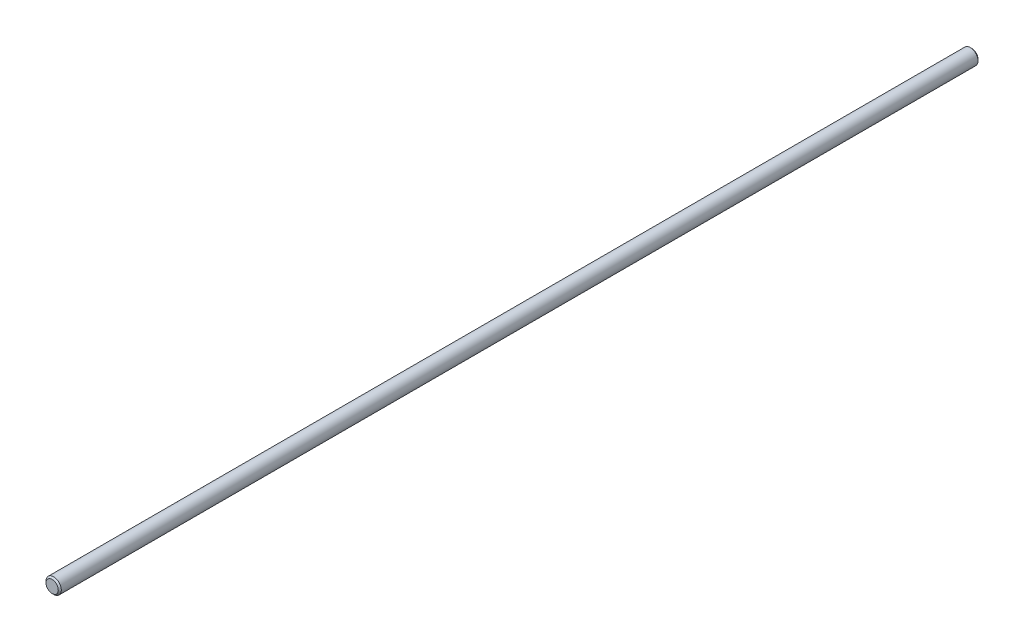
ISO-10303-21;
HEADER;
FILE_DESCRIPTION(('STEP AP214'),'2;1');
FILE_NAME('part.step','',(''),(''),'','','');
FILE_SCHEMA(('AUTOMOTIVE_DESIGN { 1 0 10303 214 1 1 1 1 }'));
ENDSEC;
DATA;
#1=APPLICATION_CONTEXT('core data for automotive mechanical design processes');
#2=APPLICATION_PROTOCOL_DEFINITION('international standard','automotive_design',2000,#1);
#3=PRODUCT_CONTEXT('',#1,'mechanical');
#4=PRODUCT('Part','Part','',(#3));
#5=PRODUCT_RELATED_PRODUCT_CATEGORY('part','',(#4));
#6=PRODUCT_DEFINITION_FORMATION('','',#4);
#7=PRODUCT_DEFINITION_CONTEXT('part definition',#1,'design');
#8=PRODUCT_DEFINITION('design','',#6,#7);
#9=PRODUCT_DEFINITION_SHAPE('','',#8);
#10=(LENGTH_UNIT() NAMED_UNIT(*) SI_UNIT(.MILLI.,.METRE.));
#11=(NAMED_UNIT(*) PLANE_ANGLE_UNIT() SI_UNIT($,.RADIAN.));
#12=(NAMED_UNIT(*) SI_UNIT($,.STERADIAN.) SOLID_ANGLE_UNIT());
#13=UNCERTAINTY_MEASURE_WITH_UNIT(LENGTH_MEASURE(1.E-05),#10,'distance_accuracy_value','');
#14=(GEOMETRIC_REPRESENTATION_CONTEXT(3) GLOBAL_UNCERTAINTY_ASSIGNED_CONTEXT((#13)) GLOBAL_UNIT_ASSIGNED_CONTEXT((#10,
#11,#12)) REPRESENTATION_CONTEXT('',''));
#15=CARTESIAN_POINT('',(0.,0.,0.));
#16=DIRECTION('',(0.,0.,1.));
#17=DIRECTION('',(1.,0.,0.));
#18=AXIS2_PLACEMENT_3D('',#15,#16,#17);
#19=CARTESIAN_POINT('',(0.,0.,762.));
#20=DIRECTION('',(0.,0.,-1.));
#21=DIRECTION('',(-1.,0.,0.));
#22=AXIS2_PLACEMENT_3D('',#19,#20,#21);
#23=CYLINDRICAL_SURFACE('',#22,12.7);
#24=CARTESIAN_POINT('',(0.,0.,-759.46));
#25=DIRECTION('',(0.,0.,1.));
#26=DIRECTION('',(1.,0.,0.));
#27=AXIS2_PLACEMENT_3D('',#24,#25,#26);
#28=CIRCLE('',#27,12.7);
#29=CARTESIAN_POINT('',(12.7,0.,-759.46));
#30=VERTEX_POINT('',#29);
#31=EDGE_CURVE('E44',#30,#30,#28,.T.);
#32=ORIENTED_EDGE('',*,*,#31,.T.);
#33=EDGE_LOOP('',(#32));
#34=FACE_BOUND('',#33,.T.);
#35=CARTESIAN_POINT('',(0.,0.,759.46));
#36=DIRECTION('',(0.,0.,1.));
#37=DIRECTION('',(1.,0.,0.));
#38=AXIS2_PLACEMENT_3D('',#35,#36,#37);
#39=CIRCLE('',#38,12.7);
#40=CARTESIAN_POINT('',(12.7,0.,759.46));
#41=VERTEX_POINT('',#40);
#42=EDGE_CURVE('E48',#41,#41,#39,.F.);
#43=ORIENTED_EDGE('',*,*,#42,.T.);
#44=EDGE_LOOP('',(#43));
#45=FACE_BOUND('',#44,.T.);
#46=ADVANCED_FACE('F33',(#34,#45),#23,.T.);
#47=CARTESIAN_POINT('',(0.,0.,762.));
#48=DIRECTION('',(0.,0.,1.));
#49=DIRECTION('',(1.,0.,0.));
#50=AXIS2_PLACEMENT_3D('',#47,#48,#49);
#51=PLANE('',#50);
#52=CARTESIAN_POINT('',(0.,0.,762.));
#53=DIRECTION('',(0.,0.,1.));
#54=DIRECTION('',(1.,0.,0.));
#55=AXIS2_PLACEMENT_3D('',#52,#53,#54);
#56=CIRCLE('',#55,10.1599999999999);
#57=CARTESIAN_POINT('',(10.1599999999999,0.,762.));
#58=VERTEX_POINT('',#57);
#59=EDGE_CURVE('E10',#58,#58,#56,.T.);
#60=ORIENTED_EDGE('',*,*,#59,.T.);
#61=EDGE_LOOP('',(#60));
#62=FACE_BOUND('',#61,.T.);
#63=ADVANCED_FACE('F64',(#62),#51,.T.);
#64=CARTESIAN_POINT('',(0.,0.,-762.));
#65=DIRECTION('',(0.,0.,1.));
#66=DIRECTION('',(1.,0.,0.));
#67=AXIS2_PLACEMENT_3D('',#64,#65,#66);
#68=PLANE('',#67);
#69=CARTESIAN_POINT('',(0.,0.,-762.));
#70=DIRECTION('',(0.,0.,1.));
#71=DIRECTION('',(1.,0.,0.));
#72=AXIS2_PLACEMENT_3D('',#69,#70,#71);
#73=CIRCLE('',#72,10.1599999999995);
#74=CARTESIAN_POINT('',(10.1599999999995,0.,-762.));
#75=VERTEX_POINT('',#74);
#76=EDGE_CURVE('E40',#75,#75,#73,.F.);
#77=ORIENTED_EDGE('',*,*,#76,.T.);
#78=EDGE_LOOP('',(#77));
#79=FACE_BOUND('',#78,.T.);
#80=ADVANCED_FACE('F61',(#79),#68,.F.);
#81=CARTESIAN_POINT('',(0.,0.,-759.46));
#82=DIRECTION('',(0.,0.,1.));
#83=DIRECTION('',(1.,0.,0.));
#84=AXIS2_PLACEMENT_3D('',#81,#82,#83);
#85=CONICAL_SURFACE('',#84,12.7,0.785398163397505);
#86=ORIENTED_EDGE('',*,*,#76,.F.);
#87=EDGE_LOOP('',(#86));
#88=FACE_BOUND('',#87,.T.);
#89=ORIENTED_EDGE('',*,*,#31,.F.);
#90=EDGE_LOOP('',(#89));
#91=FACE_BOUND('',#90,.T.);
#92=ADVANCED_FACE('F57',(#88,#91),#85,.T.);
#93=CARTESIAN_POINT('',(0.,0.,762.));
#94=DIRECTION('',(0.,0.,-1.));
#95=DIRECTION('',(-1.,0.,0.));
#96=AXIS2_PLACEMENT_3D('',#93,#94,#95);
#97=CONICAL_SURFACE('',#96,10.1599999999999,0.785398163397439);
#98=ORIENTED_EDGE('',*,*,#42,.F.);
#99=EDGE_LOOP('',(#98));
#100=FACE_BOUND('',#99,.T.);
#101=ORIENTED_EDGE('',*,*,#59,.F.);
#102=EDGE_LOOP('',(#101));
#103=FACE_BOUND('',#102,.T.);
#104=ADVANCED_FACE('F35',(#100,#103),#97,.T.);
#105=CLOSED_SHELL('',(#46,#63,#80,#92,#104));
#106=MANIFOLD_SOLID_BREP('B2',#105);
#107=ADVANCED_BREP_SHAPE_REPRESENTATION('',(#18,#106),#14);
#108=SHAPE_DEFINITION_REPRESENTATION(#9,#107);
ENDSEC;
END-ISO-10303-21;
